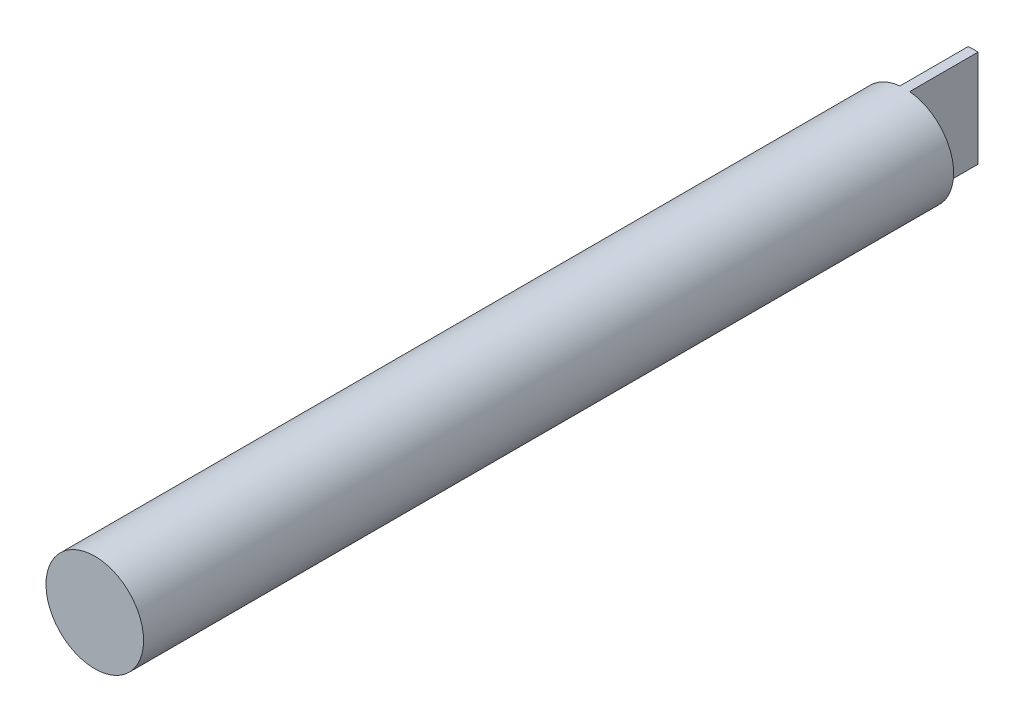
ISO-10303-21;
HEADER;
FILE_DESCRIPTION(('STEP AP214'),'2;1');
FILE_NAME('part.step','',(''),(''),'','','');
FILE_SCHEMA(('AUTOMOTIVE_DESIGN { 1 0 10303 214 1 1 1 1 }'));
ENDSEC;
DATA;
#1=APPLICATION_CONTEXT('core data for automotive mechanical design processes');
#2=APPLICATION_PROTOCOL_DEFINITION('international standard','automotive_design',2000,#1);
#3=PRODUCT_CONTEXT('',#1,'mechanical');
#4=PRODUCT('Part','Part','',(#3));
#5=PRODUCT_RELATED_PRODUCT_CATEGORY('part','',(#4));
#6=PRODUCT_DEFINITION_FORMATION('','',#4);
#7=PRODUCT_DEFINITION_CONTEXT('part definition',#1,'design');
#8=PRODUCT_DEFINITION('design','',#6,#7);
#9=PRODUCT_DEFINITION_SHAPE('','',#8);
#10=(LENGTH_UNIT() NAMED_UNIT(*) SI_UNIT(.MILLI.,.METRE.));
#11=(NAMED_UNIT(*) PLANE_ANGLE_UNIT() SI_UNIT($,.RADIAN.));
#12=(NAMED_UNIT(*) SI_UNIT($,.STERADIAN.) SOLID_ANGLE_UNIT());
#13=UNCERTAINTY_MEASURE_WITH_UNIT(LENGTH_MEASURE(1.E-05),#10,'distance_accuracy_value','');
#14=(GEOMETRIC_REPRESENTATION_CONTEXT(3) GLOBAL_UNCERTAINTY_ASSIGNED_CONTEXT((#13)) GLOBAL_UNIT_ASSIGNED_CONTEXT((#10,
#11,#12)) REPRESENTATION_CONTEXT('',''));
#15=CARTESIAN_POINT('',(0.,0.,0.));
#16=DIRECTION('',(0.,0.,1.));
#17=DIRECTION('',(1.,0.,0.));
#18=AXIS2_PLACEMENT_3D('',#15,#16,#17);
#19=CARTESIAN_POINT('',(208.88140451995,100.,45.));
#20=DIRECTION('',(0.,0.,-1.));
#21=DIRECTION('',(-1.,0.,0.));
#22=AXIS2_PLACEMENT_3D('',#19,#20,#21);
#23=CYLINDRICAL_SURFACE('',#22,4.99999999999999);
#24=CARTESIAN_POINT('',(208.88140451995,100.,45.));
#25=DIRECTION('',(0.,0.,1.));
#26=DIRECTION('',(1.,0.,0.));
#27=AXIS2_PLACEMENT_3D('',#24,#25,#26);
#28=CIRCLE('',#27,4.99999999999999);
#29=CARTESIAN_POINT('',(213.88140451995,100.,45.));
#30=VERTEX_POINT('',#29);
#31=EDGE_CURVE('E82',#30,#30,#28,.T.);
#32=ORIENTED_EDGE('',*,*,#31,.F.);
#33=EDGE_LOOP('',(#32));
#34=FACE_BOUND('',#33,.T.);
#35=CARTESIAN_POINT('',(208.88140451995,100.,-38.));
#36=DIRECTION('',(0.,0.,-1.));
#37=DIRECTION('',(-1.,0.,0.));
#38=AXIS2_PLACEMENT_3D('',#35,#36,#37);
#39=CIRCLE('',#38,4.99999999999999);
#40=CARTESIAN_POINT('',(209.38140451995,104.974937185533,-38.));
#41=VERTEX_POINT('',#40);
#42=CARTESIAN_POINT('',(209.38140451995,95.0250628144669,-38.));
#43=VERTEX_POINT('',#42);
#44=EDGE_CURVE('E11',#41,#43,#39,.T.);
#45=ORIENTED_EDGE('',*,*,#44,.F.);
#46=DIRECTION('',(0.,0.,-1.));
#47=VECTOR('',#46,1.);
#48=CARTESIAN_POINT('',(209.38140451995,104.974937185533,45.));
#49=LINE('',#48,#47);
#50=CARTESIAN_POINT('',(209.38140451995,104.974937185533,-45.));
#51=VERTEX_POINT('',#50);
#52=EDGE_CURVE('E92',#41,#51,#49,.T.);
#53=ORIENTED_EDGE('',*,*,#52,.T.);
#54=CARTESIAN_POINT('',(208.88140451995,100.,-45.));
#55=DIRECTION('',(0.,0.,1.));
#56=DIRECTION('',(1.,0.,0.));
#57=AXIS2_PLACEMENT_3D('',#54,#55,#56);
#58=CIRCLE('',#57,4.99999999999999);
#59=CARTESIAN_POINT('',(208.38140451995,104.974937185533,-45.));
#60=VERTEX_POINT('',#59);
#61=EDGE_CURVE('E91',#51,#60,#58,.T.);
#62=ORIENTED_EDGE('',*,*,#61,.T.);
#63=DIRECTION('',(0.,0.,-1.));
#64=VECTOR('',#63,1.);
#65=CARTESIAN_POINT('',(208.38140451995,104.974937185533,45.));
#66=LINE('',#65,#64);
#67=CARTESIAN_POINT('',(208.38140451995,104.974937185533,-38.));
#68=VERTEX_POINT('',#67);
#69=EDGE_CURVE('E56',#60,#68,#66,.F.);
#70=ORIENTED_EDGE('',*,*,#69,.T.);
#71=CARTESIAN_POINT('',(208.88140451995,100.,-38.));
#72=DIRECTION('',(0.,0.,-1.));
#73=DIRECTION('',(-1.,0.,0.));
#74=AXIS2_PLACEMENT_3D('',#71,#72,#73);
#75=CIRCLE('',#74,4.99999999999999);
#76=CARTESIAN_POINT('',(208.38140451995,95.0250628144669,-38.));
#77=VERTEX_POINT('',#76);
#78=EDGE_CURVE('E41',#77,#68,#75,.T.);
#79=ORIENTED_EDGE('',*,*,#78,.F.);
#80=DIRECTION('',(0.,0.,-1.));
#81=VECTOR('',#80,1.);
#82=CARTESIAN_POINT('',(208.38140451995,95.0250628144669,45.));
#83=LINE('',#82,#81);
#84=CARTESIAN_POINT('',(208.38140451995,95.0250628144669,-45.));
#85=VERTEX_POINT('',#84);
#86=EDGE_CURVE('E75',#77,#85,#83,.T.);
#87=ORIENTED_EDGE('',*,*,#86,.T.);
#88=CARTESIAN_POINT('',(209.38140451995,95.0250628144669,-45.));
#89=VERTEX_POINT('',#88);
#90=EDGE_CURVE('E88',#85,#89,#58,.T.);
#91=ORIENTED_EDGE('',*,*,#90,.T.);
#92=DIRECTION('',(0.,0.,-1.));
#93=VECTOR('',#92,1.);
#94=CARTESIAN_POINT('',(209.38140451995,95.0250628144669,45.));
#95=LINE('',#94,#93);
#96=EDGE_CURVE('E48',#89,#43,#95,.F.);
#97=ORIENTED_EDGE('',*,*,#96,.T.);
#98=EDGE_LOOP('',(#45,#53,#62,#70,#79,#87,#91,#97));
#99=FACE_BOUND('',#98,.T.);
#100=ADVANCED_FACE('F34',(#34,#99),#23,.T.);
#101=CARTESIAN_POINT('',(208.88140451995,100.,45.));
#102=DIRECTION('',(0.,0.,1.));
#103=DIRECTION('',(1.,0.,0.));
#104=AXIS2_PLACEMENT_3D('',#101,#102,#103);
#105=PLANE('',#104);
#106=ORIENTED_EDGE('',*,*,#31,.T.);
#107=EDGE_LOOP('',(#106));
#108=FACE_BOUND('',#107,.T.);
#109=ADVANCED_FACE('F118',(#108),#105,.T.);
#110=CARTESIAN_POINT('',(208.88140451995,100.,-45.));
#111=DIRECTION('',(0.,0.,1.));
#112=DIRECTION('',(1.,0.,0.));
#113=AXIS2_PLACEMENT_3D('',#110,#111,#112);
#114=PLANE('',#113);
#115=ORIENTED_EDGE('',*,*,#61,.F.);
#116=DIRECTION('',(0.,-1.,0.));
#117=VECTOR('',#116,1.);
#118=CARTESIAN_POINT('',(209.38140451995,100.,-45.));
#119=LINE('',#118,#117);
#120=EDGE_CURVE('E81',#51,#89,#119,.T.);
#121=ORIENTED_EDGE('',*,*,#120,.T.);
#122=ORIENTED_EDGE('',*,*,#90,.F.);
#123=DIRECTION('',(0.,1.,0.));
#124=VECTOR('',#123,1.);
#125=CARTESIAN_POINT('',(208.38140451995,100.,-45.));
#126=LINE('',#125,#124);
#127=EDGE_CURVE('E72',#85,#60,#126,.T.);
#128=ORIENTED_EDGE('',*,*,#127,.T.);
#129=EDGE_LOOP('',(#115,#121,#122,#128));
#130=FACE_BOUND('',#129,.T.);
#131=ADVANCED_FACE('F90',(#130),#114,.F.);
#132=CARTESIAN_POINT('',(0.,0.,-38.));
#133=DIRECTION('',(0.,0.,-1.));
#134=DIRECTION('',(-1.,0.,0.));
#135=AXIS2_PLACEMENT_3D('',#132,#133,#134);
#136=PLANE('',#135);
#137=ORIENTED_EDGE('',*,*,#78,.T.);
#138=DIRECTION('',(0.,-1.,0.));
#139=VECTOR('',#138,1.);
#140=CARTESIAN_POINT('',(208.38140451995,105.,-38.));
#141=LINE('',#140,#139);
#142=EDGE_CURVE('E100',#68,#77,#141,.T.);
#143=ORIENTED_EDGE('',*,*,#142,.T.);
#144=EDGE_LOOP('',(#137,#143));
#145=FACE_BOUND('',#144,.T.);
#146=ADVANCED_FACE('F99',(#145),#136,.T.);
#147=CARTESIAN_POINT('',(208.38140451995,105.,-38.));
#148=DIRECTION('',(1.,0.,0.));
#149=DIRECTION('',(0.,0.,-1.));
#150=AXIS2_PLACEMENT_3D('',#147,#148,#149);
#151=PLANE('',#150);
#152=ORIENTED_EDGE('',*,*,#142,.F.);
#153=ORIENTED_EDGE('',*,*,#69,.F.);
#154=ORIENTED_EDGE('',*,*,#127,.F.);
#155=ORIENTED_EDGE('',*,*,#86,.F.);
#156=EDGE_LOOP('',(#152,#153,#154,#155));
#157=FACE_BOUND('',#156,.T.);
#158=ADVANCED_FACE('F74',(#157),#151,.F.);
#159=CARTESIAN_POINT('',(0.,0.,-38.));
#160=DIRECTION('',(0.,0.,-1.));
#161=DIRECTION('',(-1.,0.,0.));
#162=AXIS2_PLACEMENT_3D('',#159,#160,#161);
#163=PLANE('',#162);
#164=ORIENTED_EDGE('',*,*,#44,.T.);
#165=DIRECTION('',(0.,1.,0.));
#166=VECTOR('',#165,1.);
#167=CARTESIAN_POINT('',(209.38140451995,105.,-38.));
#168=LINE('',#167,#166);
#169=EDGE_CURVE('E101',#43,#41,#168,.T.);
#170=ORIENTED_EDGE('',*,*,#169,.T.);
#171=EDGE_LOOP('',(#164,#170));
#172=FACE_BOUND('',#171,.T.);
#173=ADVANCED_FACE('F108',(#172),#163,.T.);
#174=CARTESIAN_POINT('',(209.38140451995,105.,-38.));
#175=DIRECTION('',(-1.,0.,0.));
#176=DIRECTION('',(0.,0.,1.));
#177=AXIS2_PLACEMENT_3D('',#174,#175,#176);
#178=PLANE('',#177);
#179=ORIENTED_EDGE('',*,*,#169,.F.);
#180=ORIENTED_EDGE('',*,*,#96,.F.);
#181=ORIENTED_EDGE('',*,*,#120,.F.);
#182=ORIENTED_EDGE('',*,*,#52,.F.);
#183=EDGE_LOOP('',(#179,#180,#181,#182));
#184=FACE_BOUND('',#183,.T.);
#185=ADVANCED_FACE('F109',(#184),#178,.F.);
#186=CLOSED_SHELL('',(#100,#109,#131,#146,#158,#173,#185));
#187=MANIFOLD_SOLID_BREP('B2',#186);
#188=ADVANCED_BREP_SHAPE_REPRESENTATION('',(#18,#187),#14);
#189=SHAPE_DEFINITION_REPRESENTATION(#9,#188);
ENDSEC;
END-ISO-10303-21;
